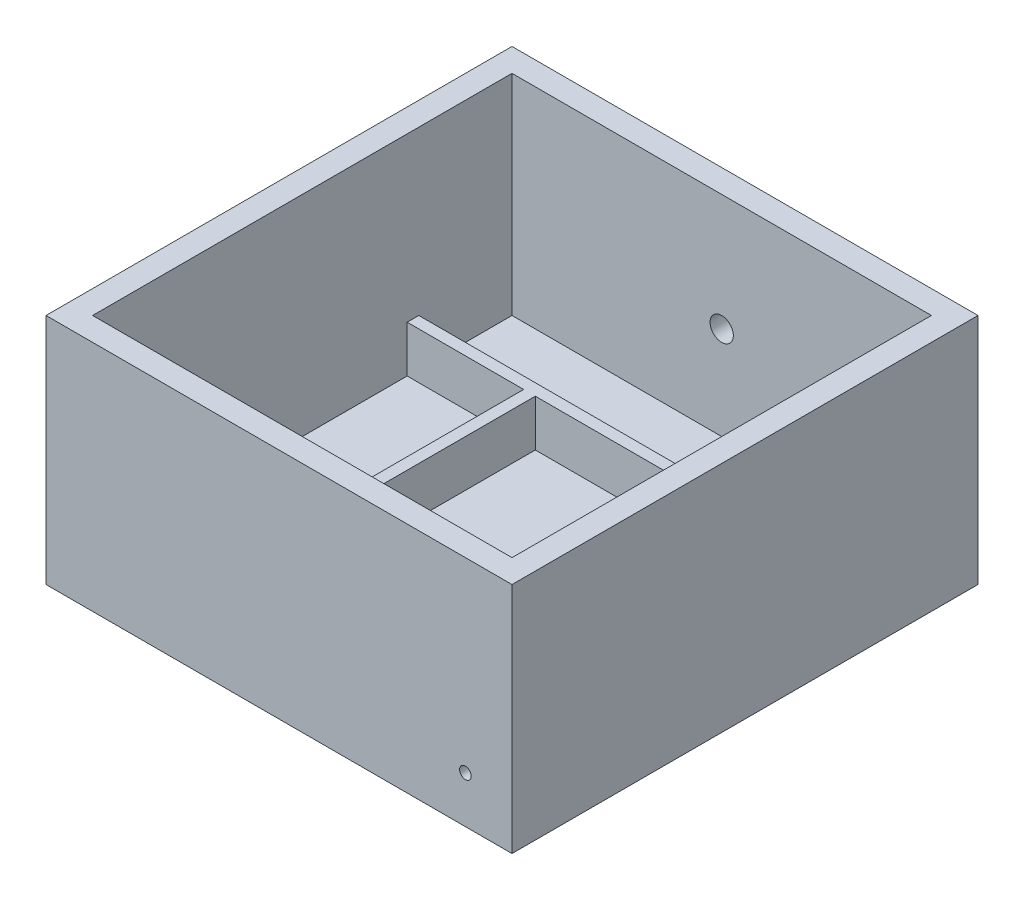
ISO-10303-21;
HEADER;
FILE_DESCRIPTION(('STEP AP214'),'2;1');
FILE_NAME('part.step','',(''),(''),'','','');
FILE_SCHEMA(('AUTOMOTIVE_DESIGN { 1 0 10303 214 1 1 1 1 }'));
ENDSEC;
DATA;
#1=APPLICATION_CONTEXT('core data for automotive mechanical design processes');
#2=APPLICATION_PROTOCOL_DEFINITION('international standard','automotive_design',2000,#1);
#3=PRODUCT_CONTEXT('',#1,'mechanical');
#4=PRODUCT('Part','Part','',(#3));
#5=PRODUCT_RELATED_PRODUCT_CATEGORY('part','',(#4));
#6=PRODUCT_DEFINITION_FORMATION('','',#4);
#7=PRODUCT_DEFINITION_CONTEXT('part definition',#1,'design');
#8=PRODUCT_DEFINITION('design','',#6,#7);
#9=PRODUCT_DEFINITION_SHAPE('','',#8);
#10=(LENGTH_UNIT() NAMED_UNIT(*) SI_UNIT(.MILLI.,.METRE.));
#11=(NAMED_UNIT(*) PLANE_ANGLE_UNIT() SI_UNIT($,.RADIAN.));
#12=(NAMED_UNIT(*) SI_UNIT($,.STERADIAN.) SOLID_ANGLE_UNIT());
#13=UNCERTAINTY_MEASURE_WITH_UNIT(LENGTH_MEASURE(1.E-05),#10,'distance_accuracy_value','');
#14=(GEOMETRIC_REPRESENTATION_CONTEXT(3) GLOBAL_UNCERTAINTY_ASSIGNED_CONTEXT((#13)) GLOBAL_UNIT_ASSIGNED_CONTEXT((#10,
#11,#12)) REPRESENTATION_CONTEXT('',''));
#15=CARTESIAN_POINT('',(0.,0.,0.));
#16=DIRECTION('',(0.,0.,1.));
#17=DIRECTION('',(1.,0.,0.));
#18=AXIS2_PLACEMENT_3D('',#15,#16,#17);
#19=CARTESIAN_POINT('',(-4455.05263157895,100.,2536.68421052632));
#20=DIRECTION('',(0.,0.,-1.));
#21=DIRECTION('',(-1.,0.,0.));
#22=AXIS2_PLACEMENT_3D('',#19,#20,#21);
#23=PLANE('',#22);
#24=CARTESIAN_POINT('',(-4285.05263157895,20.,2536.68421052632));
#25=DIRECTION('',(0.,0.,1.));
#26=DIRECTION('',(1.,0.,0.));
#27=AXIS2_PLACEMENT_3D('',#24,#25,#26);
#28=CIRCLE('',#27,2.50000000000016);
#29=CARTESIAN_POINT('',(-4282.55263157895,20.,2536.68421052632));
#30=VERTEX_POINT('',#29);
#31=EDGE_CURVE('E202',#30,#30,#28,.T.);
#32=ORIENTED_EDGE('',*,*,#31,.T.);
#33=EDGE_LOOP('',(#32));
#34=FACE_BOUND('',#33,.T.);
#35=DIRECTION('',(-1.,0.,0.));
#36=VECTOR('',#35,1.);
#37=CARTESIAN_POINT('',(-4455.05263157895,9.99999999999999,2536.68421052632));
#38=LINE('',#37,#36);
#39=CARTESIAN_POINT('',(-4275.05263157895,9.99999999999999,2536.68421052632));
#40=VERTEX_POINT('',#39);
#41=CARTESIAN_POINT('',(-4400.05263157895,9.99999999999999,2536.68421052632));
#42=VERTEX_POINT('',#41);
#43=EDGE_CURVE('E247',#40,#42,#38,.T.);
#44=ORIENTED_EDGE('',*,*,#43,.T.);
#45=DIRECTION('',(0.,-1.,0.));
#46=VECTOR('',#45,1.);
#47=CARTESIAN_POINT('',(-4400.05263157895,30.,2536.68421052632));
#48=LINE('',#47,#46);
#49=CARTESIAN_POINT('',(-4400.05263157895,30.,2536.68421052632));
#50=VERTEX_POINT('',#49);
#51=EDGE_CURVE('E174',#50,#42,#48,.T.);
#52=ORIENTED_EDGE('',*,*,#51,.F.);
#53=DIRECTION('',(1.,0.,0.));
#54=VECTOR('',#53,1.);
#55=CARTESIAN_POINT('',(0.,30.,2536.68421052632));
#56=LINE('',#55,#54);
#57=CARTESIAN_POINT('',(-4405.05263157895,30.,2536.68421052632));
#58=VERTEX_POINT('',#57);
#59=EDGE_CURVE('E161',#58,#50,#56,.T.);
#60=ORIENTED_EDGE('',*,*,#59,.F.);
#61=DIRECTION('',(0.,-1.,0.));
#62=VECTOR('',#61,1.);
#63=CARTESIAN_POINT('',(-4405.05263157895,30.,2536.68421052632));
#64=LINE('',#63,#62);
#65=CARTESIAN_POINT('',(-4405.05263157895,10.,2536.68421052632));
#66=VERTEX_POINT('',#65);
#67=EDGE_CURVE('E191',#58,#66,#64,.T.);
#68=ORIENTED_EDGE('',*,*,#67,.T.);
#69=CARTESIAN_POINT('',(-4455.05263157895,9.99999999999999,2536.68421052632));
#70=VERTEX_POINT('',#69);
#71=EDGE_CURVE('E246',#66,#70,#38,.T.);
#72=ORIENTED_EDGE('',*,*,#71,.T.);
#73=DIRECTION('',(0.,-1.,0.));
#74=VECTOR('',#73,1.);
#75=CARTESIAN_POINT('',(-4455.05263157895,100.,2536.68421052632));
#76=LINE('',#75,#74);
#77=CARTESIAN_POINT('',(-4455.05263157895,100.,2536.68421052632));
#78=VERTEX_POINT('',#77);
#79=EDGE_CURVE('E280',#78,#70,#76,.T.);
#80=ORIENTED_EDGE('',*,*,#79,.F.);
#81=DIRECTION('',(1.,0.,0.));
#82=VECTOR('',#81,1.);
#83=CARTESIAN_POINT('',(-4455.05263157895,100.,2536.68421052632));
#84=LINE('',#83,#82);
#85=CARTESIAN_POINT('',(-4275.05263157895,100.,2536.68421052632));
#86=VERTEX_POINT('',#85);
#87=EDGE_CURVE('E258',#78,#86,#84,.T.);
#88=ORIENTED_EDGE('',*,*,#87,.T.);
#89=DIRECTION('',(0.,-1.,0.));
#90=VECTOR('',#89,1.);
#91=CARTESIAN_POINT('',(-4275.05263157895,100.,2536.68421052632));
#92=LINE('',#91,#90);
#93=EDGE_CURVE('E276',#86,#40,#92,.T.);
#94=ORIENTED_EDGE('',*,*,#93,.T.);
#95=EDGE_LOOP('',(#44,#52,#60,#68,#72,#80,#88,#94));
#96=FACE_BOUND('',#95,.T.);
#97=ADVANCED_FACE('F39',(#34,#96),#23,.T.);
#98=CARTESIAN_POINT('',(-4275.05263157895,100.,2356.68421052632));
#99=DIRECTION('',(-1.,0.,0.));
#100=DIRECTION('',(0.,0.,1.));
#101=AXIS2_PLACEMENT_3D('',#98,#99,#100);
#102=PLANE('',#101);
#103=DIRECTION('',(0.,0.,-1.));
#104=VECTOR('',#103,1.);
#105=CARTESIAN_POINT('',(-4275.05263157895,30.,0.));
#106=LINE('',#105,#104);
#107=CARTESIAN_POINT('',(-4275.05263157895,30.,2401.68421052632));
#108=VERTEX_POINT('',#107);
#109=CARTESIAN_POINT('',(-4275.05263157895,30.,2396.68421052632));
#110=VERTEX_POINT('',#109);
#111=EDGE_CURVE('E179',#108,#110,#106,.T.);
#112=ORIENTED_EDGE('',*,*,#111,.F.);
#113=DIRECTION('',(0.,-1.,0.));
#114=VECTOR('',#113,1.);
#115=CARTESIAN_POINT('',(-4275.05263157895,30.,2401.68421052632));
#116=LINE('',#115,#114);
#117=CARTESIAN_POINT('',(-4275.05263157895,9.99999999999999,2401.68421052632));
#118=VERTEX_POINT('',#117);
#119=EDGE_CURVE('E175',#108,#118,#116,.T.);
#120=ORIENTED_EDGE('',*,*,#119,.T.);
#121=DIRECTION('',(0.,0.,1.));
#122=VECTOR('',#121,1.);
#123=CARTESIAN_POINT('',(-4275.05263157895,9.99999999999999,2356.68421052632));
#124=LINE('',#123,#122);
#125=EDGE_CURVE('E238',#118,#40,#124,.T.);
#126=ORIENTED_EDGE('',*,*,#125,.T.);
#127=ORIENTED_EDGE('',*,*,#93,.F.);
#128=DIRECTION('',(0.,0.,-1.));
#129=VECTOR('',#128,1.);
#130=CARTESIAN_POINT('',(-4275.05263157895,100.,2356.68421052632));
#131=LINE('',#130,#129);
#132=CARTESIAN_POINT('',(-4275.05263157895,100.,2356.68421052632));
#133=VERTEX_POINT('',#132);
#134=EDGE_CURVE('E261',#86,#133,#131,.T.);
#135=ORIENTED_EDGE('',*,*,#134,.T.);
#136=DIRECTION('',(0.,-1.,0.));
#137=VECTOR('',#136,1.);
#138=CARTESIAN_POINT('',(-4275.05263157895,100.,2356.68421052632));
#139=LINE('',#138,#137);
#140=CARTESIAN_POINT('',(-4275.05263157895,9.99999999999999,2356.68421052632));
#141=VERTEX_POINT('',#140);
#142=EDGE_CURVE('E272',#133,#141,#139,.T.);
#143=ORIENTED_EDGE('',*,*,#142,.T.);
#144=CARTESIAN_POINT('',(-4275.05263157895,9.99999999999999,2396.68421052632));
#145=VERTEX_POINT('',#144);
#146=EDGE_CURVE('E242',#141,#145,#124,.T.);
#147=ORIENTED_EDGE('',*,*,#146,.T.);
#148=DIRECTION('',(0.,-1.,0.));
#149=VECTOR('',#148,1.);
#150=CARTESIAN_POINT('',(-4275.05263157895,30.,2396.68421052632));
#151=LINE('',#150,#149);
#152=EDGE_CURVE('E225',#110,#145,#151,.T.);
#153=ORIENTED_EDGE('',*,*,#152,.F.);
#154=EDGE_LOOP('',(#112,#120,#126,#127,#135,#143,#147,#153));
#155=FACE_BOUND('',#154,.T.);
#156=ADVANCED_FACE('F356',(#155),#102,.T.);
#157=CARTESIAN_POINT('',(0.,10.,0.));
#158=DIRECTION('',(0.,-1.,0.));
#159=DIRECTION('',(0.,0.,-1.));
#160=AXIS2_PLACEMENT_3D('',#157,#158,#159);
#161=PLANE('',#160);
#162=DIRECTION('',(0.,0.,-1.));
#163=VECTOR('',#162,1.);
#164=CARTESIAN_POINT('',(-4400.05263157895,10.,0.));
#165=LINE('',#164,#163);
#166=CARTESIAN_POINT('',(-4400.05263157895,10.,2401.68421052632));
#167=VERTEX_POINT('',#166);
#168=EDGE_CURVE('E170',#42,#167,#165,.T.);
#169=ORIENTED_EDGE('',*,*,#168,.F.);
#170=ORIENTED_EDGE('',*,*,#43,.F.);
#171=ORIENTED_EDGE('',*,*,#125,.F.);
#172=DIRECTION('',(1.,0.,0.));
#173=VECTOR('',#172,1.);
#174=CARTESIAN_POINT('',(0.,10.,2401.68421052632));
#175=LINE('',#174,#173);
#176=EDGE_CURVE('E201',#167,#118,#175,.T.);
#177=ORIENTED_EDGE('',*,*,#176,.F.);
#178=EDGE_LOOP('',(#169,#170,#171,#177));
#179=FACE_BOUND('',#178,.T.);
#180=ADVANCED_FACE('F361',(#179),#161,.F.);
#181=CARTESIAN_POINT('',(-4455.05263157895,9.99999999999999,2401.68421052632));
#182=VERTEX_POINT('',#181);
#183=CARTESIAN_POINT('',(-4405.05263157895,10.,2401.68421052632));
#184=VERTEX_POINT('',#183);
#185=EDGE_CURVE('E206',#182,#184,#175,.T.);
#186=ORIENTED_EDGE('',*,*,#185,.F.);
#187=DIRECTION('',(0.,0.,-1.));
#188=VECTOR('',#187,1.);
#189=CARTESIAN_POINT('',(-4455.05263157895,9.99999999999999,2356.68421052632));
#190=LINE('',#189,#188);
#191=EDGE_CURVE('E252',#70,#182,#190,.T.);
#192=ORIENTED_EDGE('',*,*,#191,.F.);
#193=ORIENTED_EDGE('',*,*,#71,.F.);
#194=DIRECTION('',(0.,0.,1.));
#195=VECTOR('',#194,1.);
#196=CARTESIAN_POINT('',(-4405.05263157895,10.,0.));
#197=LINE('',#196,#195);
#198=EDGE_CURVE('E209',#184,#66,#197,.T.);
#199=ORIENTED_EDGE('',*,*,#198,.F.);
#200=EDGE_LOOP('',(#186,#192,#193,#199));
#201=FACE_BOUND('',#200,.T.);
#202=ADVANCED_FACE('F370',(#201),#161,.F.);
#203=CARTESIAN_POINT('',(-4455.05263157895,100.,2356.68421052632));
#204=DIRECTION('',(1.,0.,0.));
#205=DIRECTION('',(0.,0.,-1.));
#206=AXIS2_PLACEMENT_3D('',#203,#204,#205);
#207=PLANE('',#206);
#208=DIRECTION('',(0.,-1.,0.));
#209=VECTOR('',#208,1.);
#210=CARTESIAN_POINT('',(-4455.05263157895,30.,2396.68421052632));
#211=LINE('',#210,#209);
#212=CARTESIAN_POINT('',(-4455.05263157895,30.,2396.68421052632));
#213=VERTEX_POINT('',#212);
#214=CARTESIAN_POINT('',(-4455.05263157895,9.99999999999999,2396.68421052632));
#215=VERTEX_POINT('',#214);
#216=EDGE_CURVE('E222',#213,#215,#211,.T.);
#217=ORIENTED_EDGE('',*,*,#216,.T.);
#218=CARTESIAN_POINT('',(-4455.05263157895,9.99999999999999,2356.68421052632));
#219=VERTEX_POINT('',#218);
#220=EDGE_CURVE('E251',#215,#219,#190,.T.);
#221=ORIENTED_EDGE('',*,*,#220,.T.);
#222=DIRECTION('',(0.,-1.,0.));
#223=VECTOR('',#222,1.);
#224=CARTESIAN_POINT('',(-4455.05263157895,100.,2356.68421052632));
#225=LINE('',#224,#223);
#226=CARTESIAN_POINT('',(-4455.05263157895,100.,2356.68421052632));
#227=VERTEX_POINT('',#226);
#228=EDGE_CURVE('E268',#227,#219,#225,.T.);
#229=ORIENTED_EDGE('',*,*,#228,.F.);
#230=DIRECTION('',(0.,0.,1.));
#231=VECTOR('',#230,1.);
#232=CARTESIAN_POINT('',(-4455.05263157895,100.,2356.68421052632));
#233=LINE('',#232,#231);
#234=EDGE_CURVE('E255',#227,#78,#233,.T.);
#235=ORIENTED_EDGE('',*,*,#234,.T.);
#236=ORIENTED_EDGE('',*,*,#79,.T.);
#237=ORIENTED_EDGE('',*,*,#191,.T.);
#238=DIRECTION('',(0.,-1.,0.));
#239=VECTOR('',#238,1.);
#240=CARTESIAN_POINT('',(-4455.05263157895,30.,2401.68421052632));
#241=LINE('',#240,#239);
#242=CARTESIAN_POINT('',(-4455.05263157895,30.,2401.68421052632));
#243=VERTEX_POINT('',#242);
#244=EDGE_CURVE('E55',#243,#182,#241,.T.);
#245=ORIENTED_EDGE('',*,*,#244,.F.);
#246=DIRECTION('',(0.,0.,1.));
#247=VECTOR('',#246,1.);
#248=CARTESIAN_POINT('',(-4455.05263157896,30.,2.19826755888703E-11));
#249=LINE('',#248,#247);
#250=EDGE_CURVE('E59',#213,#243,#249,.T.);
#251=ORIENTED_EDGE('',*,*,#250,.F.);
#252=EDGE_LOOP('',(#217,#221,#229,#235,#236,#237,#245,#251));
#253=FACE_BOUND('',#252,.T.);
#254=ADVANCED_FACE('F401',(#253),#207,.T.);
#255=CARTESIAN_POINT('',(-4455.05263157895,100.,2356.68421052632));
#256=DIRECTION('',(0.,0.,1.));
#257=DIRECTION('',(1.,0.,0.));
#258=AXIS2_PLACEMENT_3D('',#255,#256,#257);
#259=PLANE('',#258);
#260=CARTESIAN_POINT('',(-4365.05263157895,50.,2356.68421052632));
#261=DIRECTION('',(0.,0.,-1.));
#262=DIRECTION('',(-1.,0.,0.));
#263=AXIS2_PLACEMENT_3D('',#260,#261,#262);
#264=CIRCLE('',#263,5.00000000000025);
#265=CARTESIAN_POINT('',(-4370.05263157895,50.,2356.68421052632));
#266=VERTEX_POINT('',#265);
#267=EDGE_CURVE('E234',#266,#266,#264,.T.);
#268=ORIENTED_EDGE('',*,*,#267,.T.);
#269=EDGE_LOOP('',(#268));
#270=FACE_BOUND('',#269,.T.);
#271=ORIENTED_EDGE('',*,*,#228,.T.);
#272=DIRECTION('',(1.,0.,0.));
#273=VECTOR('',#272,1.);
#274=CARTESIAN_POINT('',(-4455.05263157895,9.99999999999999,2356.68421052632));
#275=LINE('',#274,#273);
#276=EDGE_CURVE('E11',#219,#141,#275,.T.);
#277=ORIENTED_EDGE('',*,*,#276,.T.);
#278=ORIENTED_EDGE('',*,*,#142,.F.);
#279=DIRECTION('',(-1.,0.,0.));
#280=VECTOR('',#279,1.);
#281=CARTESIAN_POINT('',(-4455.05263157895,100.,2356.68421052632));
#282=LINE('',#281,#280);
#283=EDGE_CURVE('E265',#133,#227,#282,.T.);
#284=ORIENTED_EDGE('',*,*,#283,.T.);
#285=EDGE_LOOP('',(#271,#277,#278,#284));
#286=FACE_BOUND('',#285,.T.);
#287=ADVANCED_FACE('F346',(#270,#286),#259,.T.);
#288=CARTESIAN_POINT('',(0.,100.,0.));
#289=DIRECTION('',(0.,1.,0.));
#290=DIRECTION('',(0.,0.,1.));
#291=AXIS2_PLACEMENT_3D('',#288,#289,#290);
#292=PLANE('',#291);
#293=DIRECTION('',(0.,0.,1.));
#294=VECTOR('',#293,1.);
#295=CARTESIAN_POINT('',(-4465.05263157895,100.,2346.68421052632));
#296=LINE('',#295,#294);
#297=CARTESIAN_POINT('',(-4465.05263157895,100.,2346.68421052632));
#298=VERTEX_POINT('',#297);
#299=CARTESIAN_POINT('',(-4465.05263157895,100.,2546.68421052632));
#300=VERTEX_POINT('',#299);
#301=EDGE_CURVE('E285',#298,#300,#296,.T.);
#302=ORIENTED_EDGE('',*,*,#301,.T.);
#303=DIRECTION('',(1.,0.,0.));
#304=VECTOR('',#303,1.);
#305=CARTESIAN_POINT('',(-4465.05263157895,100.,2546.68421052632));
#306=LINE('',#305,#304);
#307=CARTESIAN_POINT('',(-4265.05263157895,100.,2546.68421052632));
#308=VERTEX_POINT('',#307);
#309=EDGE_CURVE('E289',#300,#308,#306,.T.);
#310=ORIENTED_EDGE('',*,*,#309,.T.);
#311=DIRECTION('',(0.,0.,-1.));
#312=VECTOR('',#311,1.);
#313=CARTESIAN_POINT('',(-4265.05263157895,100.,2346.68421052632));
#314=LINE('',#313,#312);
#315=CARTESIAN_POINT('',(-4265.05263157895,100.,2346.68421052632));
#316=VERTEX_POINT('',#315);
#317=EDGE_CURVE('E293',#308,#316,#314,.T.);
#318=ORIENTED_EDGE('',*,*,#317,.T.);
#319=DIRECTION('',(-1.,0.,0.));
#320=VECTOR('',#319,1.);
#321=CARTESIAN_POINT('',(-4465.05263157895,100.,2346.68421052632));
#322=LINE('',#321,#320);
#323=EDGE_CURVE('E296',#316,#298,#322,.T.);
#324=ORIENTED_EDGE('',*,*,#323,.T.);
#325=EDGE_LOOP('',(#302,#310,#318,#324));
#326=FACE_BOUND('',#325,.T.);
#327=ORIENTED_EDGE('',*,*,#87,.F.);
#328=ORIENTED_EDGE('',*,*,#234,.F.);
#329=ORIENTED_EDGE('',*,*,#283,.F.);
#330=ORIENTED_EDGE('',*,*,#134,.F.);
#331=EDGE_LOOP('',(#327,#328,#329,#330));
#332=FACE_BOUND('',#331,.T.);
#333=ADVANCED_FACE('F343',(#326,#332),#292,.T.);
#334=CARTESIAN_POINT('',(0.,0.,0.));
#335=DIRECTION('',(0.,1.,0.));
#336=DIRECTION('',(0.,0.,1.));
#337=AXIS2_PLACEMENT_3D('',#334,#335,#336);
#338=PLANE('',#337);
#339=DIRECTION('',(0.,0.,1.));
#340=VECTOR('',#339,1.);
#341=CARTESIAN_POINT('',(-4465.05263157895,0.,2346.68421052632));
#342=LINE('',#341,#340);
#343=CARTESIAN_POINT('',(-4465.05263157895,0.,2346.68421052632));
#344=VERTEX_POINT('',#343);
#345=CARTESIAN_POINT('',(-4465.05263157895,0.,2546.68421052632));
#346=VERTEX_POINT('',#345);
#347=EDGE_CURVE('E284',#344,#346,#342,.T.);
#348=ORIENTED_EDGE('',*,*,#347,.F.);
#349=DIRECTION('',(-1.,0.,0.));
#350=VECTOR('',#349,1.);
#351=CARTESIAN_POINT('',(-4465.05263157895,0.,2346.68421052632));
#352=LINE('',#351,#350);
#353=CARTESIAN_POINT('',(-4265.05263157895,0.,2346.68421052632));
#354=VERTEX_POINT('',#353);
#355=EDGE_CURVE('E290',#354,#344,#352,.T.);
#356=ORIENTED_EDGE('',*,*,#355,.F.);
#357=DIRECTION('',(0.,0.,-1.));
#358=VECTOR('',#357,1.);
#359=CARTESIAN_POINT('',(-4265.05263157895,0.,2346.68421052632));
#360=LINE('',#359,#358);
#361=CARTESIAN_POINT('',(-4265.05263157895,0.,2546.68421052632));
#362=VERTEX_POINT('',#361);
#363=EDGE_CURVE('E307',#362,#354,#360,.T.);
#364=ORIENTED_EDGE('',*,*,#363,.F.);
#365=DIRECTION('',(1.,0.,0.));
#366=VECTOR('',#365,1.);
#367=CARTESIAN_POINT('',(-4465.05263157895,0.,2546.68421052632));
#368=LINE('',#367,#366);
#369=EDGE_CURVE('E303',#346,#362,#368,.T.);
#370=ORIENTED_EDGE('',*,*,#369,.F.);
#371=EDGE_LOOP('',(#348,#356,#364,#370));
#372=FACE_BOUND('',#371,.T.);
#373=ADVANCED_FACE('F332',(#372),#338,.F.);
#374=CARTESIAN_POINT('',(-4465.05263157895,100.,2346.68421052632));
#375=DIRECTION('',(1.,0.,0.));
#376=DIRECTION('',(0.,0.,-1.));
#377=AXIS2_PLACEMENT_3D('',#374,#375,#376);
#378=PLANE('',#377);
#379=ORIENTED_EDGE('',*,*,#347,.T.);
#380=DIRECTION('',(0.,-1.,0.));
#381=VECTOR('',#380,1.);
#382=CARTESIAN_POINT('',(-4465.05263157895,100.,2546.68421052632));
#383=LINE('',#382,#381);
#384=EDGE_CURVE('E48',#300,#346,#383,.T.);
#385=ORIENTED_EDGE('',*,*,#384,.F.);
#386=ORIENTED_EDGE('',*,*,#301,.F.);
#387=DIRECTION('',(0.,-1.,0.));
#388=VECTOR('',#387,1.);
#389=CARTESIAN_POINT('',(-4465.05263157895,100.,2346.68421052632));
#390=LINE('',#389,#388);
#391=EDGE_CURVE('E299',#298,#344,#390,.T.);
#392=ORIENTED_EDGE('',*,*,#391,.T.);
#393=EDGE_LOOP('',(#379,#385,#386,#392));
#394=FACE_BOUND('',#393,.T.);
#395=ADVANCED_FACE('F41',(#394),#378,.F.);
#396=CARTESIAN_POINT('',(-4465.05263157895,100.,2546.68421052632));
#397=DIRECTION('',(0.,0.,-1.));
#398=DIRECTION('',(-1.,0.,0.));
#399=AXIS2_PLACEMENT_3D('',#396,#397,#398);
#400=PLANE('',#399);
#401=CARTESIAN_POINT('',(-4285.05263157895,20.,2546.68421052632));
#402=DIRECTION('',(0.,0.,1.));
#403=DIRECTION('',(1.,0.,0.));
#404=AXIS2_PLACEMENT_3D('',#401,#402,#403);
#405=CIRCLE('',#404,2.50000000000016);
#406=CARTESIAN_POINT('',(-4282.55263157895,20.,2546.68421052632));
#407=VERTEX_POINT('',#406);
#408=EDGE_CURVE('E378',#407,#407,#405,.T.);
#409=ORIENTED_EDGE('',*,*,#408,.F.);
#410=EDGE_LOOP('',(#409));
#411=FACE_BOUND('',#410,.T.);
#412=ORIENTED_EDGE('',*,*,#369,.T.);
#413=DIRECTION('',(0.,-1.,0.));
#414=VECTOR('',#413,1.);
#415=CARTESIAN_POINT('',(-4265.05263157895,100.,2546.68421052632));
#416=LINE('',#415,#414);
#417=EDGE_CURVE('E319',#308,#362,#416,.T.);
#418=ORIENTED_EDGE('',*,*,#417,.F.);
#419=ORIENTED_EDGE('',*,*,#309,.F.);
#420=ORIENTED_EDGE('',*,*,#384,.T.);
#421=EDGE_LOOP('',(#412,#418,#419,#420));
#422=FACE_BOUND('',#421,.T.);
#423=ADVANCED_FACE('F325',(#411,#422),#400,.F.);
#424=CARTESIAN_POINT('',(-4265.05263157895,100.,2346.68421052632));
#425=DIRECTION('',(-1.,0.,0.));
#426=DIRECTION('',(0.,0.,1.));
#427=AXIS2_PLACEMENT_3D('',#424,#425,#426);
#428=PLANE('',#427);
#429=ORIENTED_EDGE('',*,*,#363,.T.);
#430=DIRECTION('',(0.,-1.,0.));
#431=VECTOR('',#430,1.);
#432=CARTESIAN_POINT('',(-4265.05263157895,100.,2346.68421052632));
#433=LINE('',#432,#431);
#434=EDGE_CURVE('E316',#316,#354,#433,.T.);
#435=ORIENTED_EDGE('',*,*,#434,.F.);
#436=ORIENTED_EDGE('',*,*,#317,.F.);
#437=ORIENTED_EDGE('',*,*,#417,.T.);
#438=EDGE_LOOP('',(#429,#435,#436,#437));
#439=FACE_BOUND('',#438,.T.);
#440=ADVANCED_FACE('F341',(#439),#428,.F.);
#441=CARTESIAN_POINT('',(-4465.05263157895,100.,2346.68421052632));
#442=DIRECTION('',(0.,0.,1.));
#443=DIRECTION('',(1.,0.,0.));
#444=AXIS2_PLACEMENT_3D('',#441,#442,#443);
#445=PLANE('',#444);
#446=CARTESIAN_POINT('',(-4365.05263157895,50.,2346.68421052632));
#447=DIRECTION('',(0.,0.,-1.));
#448=DIRECTION('',(-1.,0.,0.));
#449=AXIS2_PLACEMENT_3D('',#446,#447,#448);
#450=CIRCLE('',#449,5.00000000000025);
#451=CARTESIAN_POINT('',(-4370.05263157895,50.,2346.68421052632));
#452=VERTEX_POINT('',#451);
#453=EDGE_CURVE('E233',#452,#452,#450,.T.);
#454=ORIENTED_EDGE('',*,*,#453,.F.);
#455=EDGE_LOOP('',(#454));
#456=FACE_BOUND('',#455,.T.);
#457=ORIENTED_EDGE('',*,*,#355,.T.);
#458=ORIENTED_EDGE('',*,*,#391,.F.);
#459=ORIENTED_EDGE('',*,*,#323,.F.);
#460=ORIENTED_EDGE('',*,*,#434,.T.);
#461=EDGE_LOOP('',(#457,#458,#459,#460));
#462=FACE_BOUND('',#461,.T.);
#463=ADVANCED_FACE('F337',(#456,#462),#445,.F.);
#464=ORIENTED_EDGE('',*,*,#220,.F.);
#465=DIRECTION('',(1.,0.,0.));
#466=VECTOR('',#465,1.);
#467=CARTESIAN_POINT('',(0.,10.,2396.68421052632));
#468=LINE('',#467,#466);
#469=EDGE_CURVE('E205',#215,#145,#468,.T.);
#470=ORIENTED_EDGE('',*,*,#469,.T.);
#471=ORIENTED_EDGE('',*,*,#146,.F.);
#472=ORIENTED_EDGE('',*,*,#276,.F.);
#473=EDGE_LOOP('',(#464,#470,#471,#472));
#474=FACE_BOUND('',#473,.T.);
#475=ADVANCED_FACE('F407',(#474),#161,.F.);
#476=CARTESIAN_POINT('',(-4365.05263157895,50.,2356.68421052632));
#477=DIRECTION('',(0.,0.,-1.));
#478=DIRECTION('',(-1.,0.,0.));
#479=AXIS2_PLACEMENT_3D('',#476,#477,#478);
#480=CYLINDRICAL_SURFACE('',#479,5.00000000000025);
#481=ORIENTED_EDGE('',*,*,#267,.F.);
#482=EDGE_LOOP('',(#481));
#483=FACE_BOUND('',#482,.T.);
#484=ORIENTED_EDGE('',*,*,#453,.T.);
#485=EDGE_LOOP('',(#484));
#486=FACE_BOUND('',#485,.T.);
#487=ADVANCED_FACE('F412',(#483,#486),#480,.F.);
#488=CARTESIAN_POINT('',(-4400.05263157895,30.,0.));
#489=DIRECTION('',(-1.,0.,0.));
#490=DIRECTION('',(0.,0.,1.));
#491=AXIS2_PLACEMENT_3D('',#488,#489,#490);
#492=PLANE('',#491);
#493=ORIENTED_EDGE('',*,*,#168,.T.);
#494=DIRECTION('',(0.,-1.,0.));
#495=VECTOR('',#494,1.);
#496=CARTESIAN_POINT('',(-4400.05263157895,30.,2401.68421052632));
#497=LINE('',#496,#495);
#498=CARTESIAN_POINT('',(-4400.05263157895,30.,2401.68421052632));
#499=VERTEX_POINT('',#498);
#500=EDGE_CURVE('E168',#499,#167,#497,.T.);
#501=ORIENTED_EDGE('',*,*,#500,.F.);
#502=DIRECTION('',(0.,0.,-1.));
#503=VECTOR('',#502,1.);
#504=CARTESIAN_POINT('',(-4400.05263157895,30.,0.));
#505=LINE('',#504,#503);
#506=EDGE_CURVE('E153',#50,#499,#505,.T.);
#507=ORIENTED_EDGE('',*,*,#506,.F.);
#508=ORIENTED_EDGE('',*,*,#51,.T.);
#509=EDGE_LOOP('',(#493,#501,#507,#508));
#510=FACE_BOUND('',#509,.T.);
#511=ADVANCED_FACE('F169',(#510),#492,.F.);
#512=CARTESIAN_POINT('',(0.,30.,2401.68421052632));
#513=DIRECTION('',(0.,0.,-1.));
#514=DIRECTION('',(-1.,0.,0.));
#515=AXIS2_PLACEMENT_3D('',#512,#513,#514);
#516=PLANE('',#515);
#517=ORIENTED_EDGE('',*,*,#176,.T.);
#518=ORIENTED_EDGE('',*,*,#119,.F.);
#519=DIRECTION('',(1.,0.,0.));
#520=VECTOR('',#519,1.);
#521=CARTESIAN_POINT('',(0.,30.,2401.68421052632));
#522=LINE('',#521,#520);
#523=EDGE_CURVE('E158',#499,#108,#522,.T.);
#524=ORIENTED_EDGE('',*,*,#523,.F.);
#525=ORIENTED_EDGE('',*,*,#500,.T.);
#526=EDGE_LOOP('',(#517,#518,#524,#525));
#527=FACE_BOUND('',#526,.T.);
#528=ADVANCED_FACE('F177',(#527),#516,.F.);
#529=CARTESIAN_POINT('',(0.,30.,2396.68421052632));
#530=DIRECTION('',(0.,0.,-1.));
#531=DIRECTION('',(-1.,0.,0.));
#532=AXIS2_PLACEMENT_3D('',#529,#530,#531);
#533=PLANE('',#532);
#534=ORIENTED_EDGE('',*,*,#469,.F.);
#535=ORIENTED_EDGE('',*,*,#216,.F.);
#536=DIRECTION('',(1.,0.,0.));
#537=VECTOR('',#536,1.);
#538=CARTESIAN_POINT('',(0.,30.,2396.68421052632));
#539=LINE('',#538,#537);
#540=EDGE_CURVE('E183',#213,#110,#539,.T.);
#541=ORIENTED_EDGE('',*,*,#540,.T.);
#542=ORIENTED_EDGE('',*,*,#152,.T.);
#543=EDGE_LOOP('',(#534,#535,#541,#542));
#544=FACE_BOUND('',#543,.T.);
#545=ADVANCED_FACE('F437',(#544),#533,.T.);
#546=ORIENTED_EDGE('',*,*,#185,.T.);
#547=DIRECTION('',(0.,-1.,0.));
#548=VECTOR('',#547,1.);
#549=CARTESIAN_POINT('',(-4405.05263157895,30.,2401.68421052632));
#550=LINE('',#549,#548);
#551=CARTESIAN_POINT('',(-4405.05263157895,30.,2401.68421052632));
#552=VERTEX_POINT('',#551);
#553=EDGE_CURVE('E216',#552,#184,#550,.T.);
#554=ORIENTED_EDGE('',*,*,#553,.F.);
#555=EDGE_CURVE('E181',#243,#552,#522,.T.);
#556=ORIENTED_EDGE('',*,*,#555,.F.);
#557=ORIENTED_EDGE('',*,*,#244,.T.);
#558=EDGE_LOOP('',(#546,#554,#556,#557));
#559=FACE_BOUND('',#558,.T.);
#560=ADVANCED_FACE('F373',(#559),#516,.F.);
#561=CARTESIAN_POINT('',(-4405.05263157895,30.,0.));
#562=DIRECTION('',(1.,0.,0.));
#563=DIRECTION('',(0.,0.,-1.));
#564=AXIS2_PLACEMENT_3D('',#561,#562,#563);
#565=PLANE('',#564);
#566=ORIENTED_EDGE('',*,*,#198,.T.);
#567=ORIENTED_EDGE('',*,*,#67,.F.);
#568=DIRECTION('',(0.,0.,1.));
#569=VECTOR('',#568,1.);
#570=CARTESIAN_POINT('',(-4405.05263157895,30.,0.));
#571=LINE('',#570,#569);
#572=EDGE_CURVE('E186',#552,#58,#571,.T.);
#573=ORIENTED_EDGE('',*,*,#572,.F.);
#574=ORIENTED_EDGE('',*,*,#553,.T.);
#575=EDGE_LOOP('',(#566,#567,#573,#574));
#576=FACE_BOUND('',#575,.T.);
#577=ADVANCED_FACE('F367',(#576),#565,.F.);
#578=CARTESIAN_POINT('',(0.,30.,0.));
#579=DIRECTION('',(0.,1.,0.));
#580=DIRECTION('',(0.,0.,1.));
#581=AXIS2_PLACEMENT_3D('',#578,#579,#580);
#582=PLANE('',#581);
#583=ORIENTED_EDGE('',*,*,#59,.T.);
#584=ORIENTED_EDGE('',*,*,#506,.T.);
#585=ORIENTED_EDGE('',*,*,#523,.T.);
#586=ORIENTED_EDGE('',*,*,#111,.T.);
#587=ORIENTED_EDGE('',*,*,#540,.F.);
#588=ORIENTED_EDGE('',*,*,#250,.T.);
#589=ORIENTED_EDGE('',*,*,#555,.T.);
#590=ORIENTED_EDGE('',*,*,#572,.T.);
#591=EDGE_LOOP('',(#583,#584,#585,#586,#587,#588,#589,#590));
#592=FACE_BOUND('',#591,.T.);
#593=ADVANCED_FACE('F155',(#592),#582,.T.);
#594=CARTESIAN_POINT('',(-4285.05263157895,20.,2536.68421052632));
#595=DIRECTION('',(0.,0.,1.));
#596=DIRECTION('',(1.,0.,0.));
#597=AXIS2_PLACEMENT_3D('',#594,#595,#596);
#598=CYLINDRICAL_SURFACE('',#597,2.50000000000016);
#599=ORIENTED_EDGE('',*,*,#31,.F.);
#600=EDGE_LOOP('',(#599));
#601=FACE_BOUND('',#600,.T.);
#602=ORIENTED_EDGE('',*,*,#408,.T.);
#603=EDGE_LOOP('',(#602));
#604=FACE_BOUND('',#603,.T.);
#605=ADVANCED_FACE('F384',(#601,#604),#598,.F.);
#606=CLOSED_SHELL('',(#97,#156,#180,#202,#254,#287,#333,#373,#395,#423,#440,#463,#475,#487,#511,
#528,#545,#560,#577,#593,#605));
#607=MANIFOLD_SOLID_BREP('B2',#606);
#608=ADVANCED_BREP_SHAPE_REPRESENTATION('',(#18,#607),#14);
#609=SHAPE_DEFINITION_REPRESENTATION(#9,#608);
ENDSEC;
END-ISO-10303-21;
